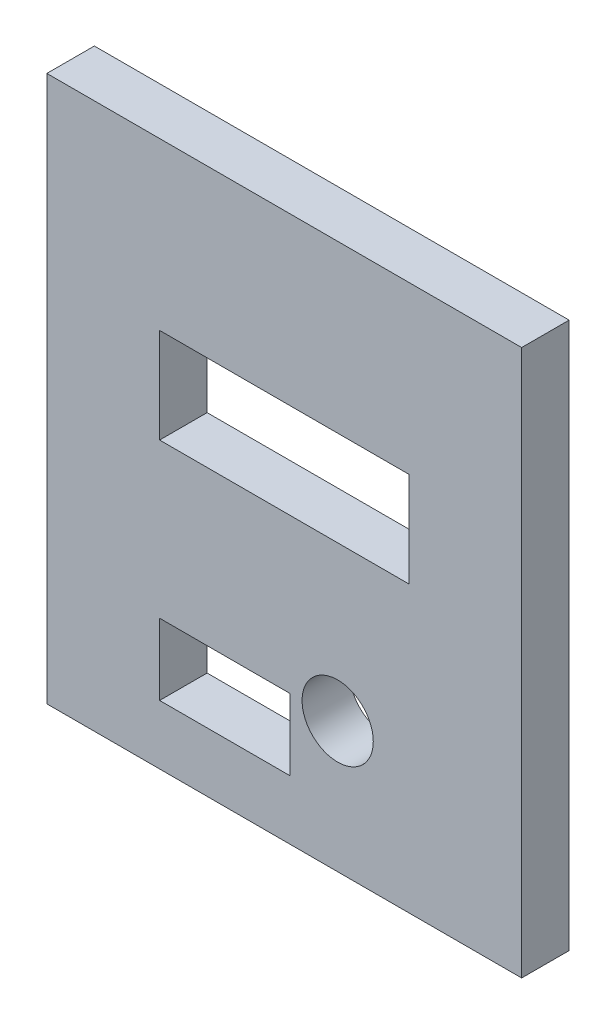
ISO-10303-21;
HEADER;
FILE_DESCRIPTION(('STEP AP214'),'2;1');
FILE_NAME('part.step','',(''),(''),'','','');
FILE_SCHEMA(('AUTOMOTIVE_DESIGN { 1 0 10303 214 1 1 1 1 }'));
ENDSEC;
DATA;
#1=APPLICATION_CONTEXT('core data for automotive mechanical design processes');
#2=APPLICATION_PROTOCOL_DEFINITION('international standard','automotive_design',2000,#1);
#3=PRODUCT_CONTEXT('',#1,'mechanical');
#4=PRODUCT('Part','Part','',(#3));
#5=PRODUCT_RELATED_PRODUCT_CATEGORY('part','',(#4));
#6=PRODUCT_DEFINITION_FORMATION('','',#4);
#7=PRODUCT_DEFINITION_CONTEXT('part definition',#1,'design');
#8=PRODUCT_DEFINITION('design','',#6,#7);
#9=PRODUCT_DEFINITION_SHAPE('','',#8);
#10=(LENGTH_UNIT() NAMED_UNIT(*) SI_UNIT(.MILLI.,.METRE.));
#11=(NAMED_UNIT(*) PLANE_ANGLE_UNIT() SI_UNIT($,.RADIAN.));
#12=(NAMED_UNIT(*) SI_UNIT($,.STERADIAN.) SOLID_ANGLE_UNIT());
#13=UNCERTAINTY_MEASURE_WITH_UNIT(LENGTH_MEASURE(1.E-05),#10,'distance_accuracy_value','');
#14=(GEOMETRIC_REPRESENTATION_CONTEXT(3) GLOBAL_UNCERTAINTY_ASSIGNED_CONTEXT((#13)) GLOBAL_UNIT_ASSIGNED_CONTEXT((#10,
#11,#12)) REPRESENTATION_CONTEXT('',''));
#15=CARTESIAN_POINT('',(0.,0.,0.));
#16=DIRECTION('',(0.,0.,1.));
#17=DIRECTION('',(1.,0.,0.));
#18=AXIS2_PLACEMENT_3D('',#15,#16,#17);
#19=CARTESIAN_POINT('',(0.,0.,2.));
#20=DIRECTION('',(0.,0.,1.));
#21=DIRECTION('',(1.,0.,0.));
#22=AXIS2_PLACEMENT_3D('',#19,#20,#21);
#23=PLANE('',#22);
#24=CARTESIAN_POINT('',(2.25,-6.,2.));
#25=DIRECTION('',(0.,0.,1.));
#26=DIRECTION('',(1.,0.,0.));
#27=AXIS2_PLACEMENT_3D('',#24,#25,#26);
#28=CIRCLE('',#27,1.5);
#29=CARTESIAN_POINT('',(3.75,-6.,2.));
#30=VERTEX_POINT('',#29);
#31=EDGE_CURVE('E224',#30,#30,#28,.T.);
#32=ORIENTED_EDGE('',*,*,#31,.F.);
#33=EDGE_LOOP('',(#32));
#34=FACE_BOUND('',#33,.T.);
#35=DIRECTION('',(0.,1.,0.));
#36=VECTOR('',#35,1.);
#37=CARTESIAN_POINT('',(0.25,0.,2.));
#38=LINE('',#37,#36);
#39=CARTESIAN_POINT('',(0.25,-9.,2.));
#40=VERTEX_POINT('',#39);
#41=CARTESIAN_POINT('',(0.25,-6.,2.));
#42=VERTEX_POINT('',#41);
#43=EDGE_CURVE('E50',#40,#42,#38,.T.);
#44=ORIENTED_EDGE('',*,*,#43,.F.);
#45=DIRECTION('',(-1.,0.,0.));
#46=VECTOR('',#45,1.);
#47=CARTESIAN_POINT('',(0.,-9.,2.));
#48=LINE('',#47,#46);
#49=CARTESIAN_POINT('',(-5.25,-9.,2.));
#50=VERTEX_POINT('',#49);
#51=EDGE_CURVE('E142',#40,#50,#48,.T.);
#52=ORIENTED_EDGE('',*,*,#51,.T.);
#53=DIRECTION('',(0.,1.,0.));
#54=VECTOR('',#53,1.);
#55=CARTESIAN_POINT('',(-5.25,0.,2.));
#56=LINE('',#55,#54);
#57=CARTESIAN_POINT('',(-5.25,-6.,2.));
#58=VERTEX_POINT('',#57);
#59=EDGE_CURVE('E127',#50,#58,#56,.T.);
#60=ORIENTED_EDGE('',*,*,#59,.T.);
#61=DIRECTION('',(-1.,0.,0.));
#62=VECTOR('',#61,1.);
#63=CARTESIAN_POINT('',(0.,-6.,2.));
#64=LINE('',#63,#62);
#65=EDGE_CURVE('E136',#42,#58,#64,.T.);
#66=ORIENTED_EDGE('',*,*,#65,.F.);
#67=EDGE_LOOP('',(#44,#52,#60,#66));
#68=FACE_BOUND('',#67,.T.);
#69=DIRECTION('',(0.,-1.,0.));
#70=VECTOR('',#69,1.);
#71=CARTESIAN_POINT('',(-10.,-11.5,2.));
#72=LINE('',#71,#70);
#73=CARTESIAN_POINT('',(-10.,11.5,2.));
#74=VERTEX_POINT('',#73);
#75=CARTESIAN_POINT('',(-10.,-11.5,2.));
#76=VERTEX_POINT('',#75);
#77=EDGE_CURVE('E173',#74,#76,#72,.T.);
#78=ORIENTED_EDGE('',*,*,#77,.T.);
#79=DIRECTION('',(1.,0.,0.));
#80=VECTOR('',#79,1.);
#81=CARTESIAN_POINT('',(10.,-11.5,2.));
#82=LINE('',#81,#80);
#83=CARTESIAN_POINT('',(10.,-11.5,2.));
#84=VERTEX_POINT('',#83);
#85=EDGE_CURVE('E176',#76,#84,#82,.T.);
#86=ORIENTED_EDGE('',*,*,#85,.T.);
#87=DIRECTION('',(0.,1.,0.));
#88=VECTOR('',#87,1.);
#89=CARTESIAN_POINT('',(10.,-11.5,2.));
#90=LINE('',#89,#88);
#91=CARTESIAN_POINT('',(10.,11.5,2.));
#92=VERTEX_POINT('',#91);
#93=EDGE_CURVE('E179',#84,#92,#90,.T.);
#94=ORIENTED_EDGE('',*,*,#93,.T.);
#95=DIRECTION('',(-1.,0.,0.));
#96=VECTOR('',#95,1.);
#97=CARTESIAN_POINT('',(10.,11.5,2.));
#98=LINE('',#97,#96);
#99=EDGE_CURVE('E181',#92,#74,#98,.T.);
#100=ORIENTED_EDGE('',*,*,#99,.T.);
#101=EDGE_LOOP('',(#78,#86,#94,#100));
#102=FACE_BOUND('',#101,.T.);
#103=DIRECTION('',(0.,1.,0.));
#104=VECTOR('',#103,1.);
#105=CARTESIAN_POINT('',(5.25,0.,2.));
#106=LINE('',#105,#104);
#107=CARTESIAN_POINT('',(5.25,0.499999999999999,2.));
#108=VERTEX_POINT('',#107);
#109=CARTESIAN_POINT('',(5.25,4.5,2.));
#110=VERTEX_POINT('',#109);
#111=EDGE_CURVE('E154',#108,#110,#106,.T.);
#112=ORIENTED_EDGE('',*,*,#111,.F.);
#113=DIRECTION('',(-1.,0.,0.));
#114=VECTOR('',#113,1.);
#115=CARTESIAN_POINT('',(0.,0.499999999999999,2.));
#116=LINE('',#115,#114);
#117=CARTESIAN_POINT('',(-5.25,0.499999999999999,2.));
#118=VERTEX_POINT('',#117);
#119=EDGE_CURVE('E149',#108,#118,#116,.T.);
#120=ORIENTED_EDGE('',*,*,#119,.T.);
#121=DIRECTION('',(0.,1.,0.));
#122=VECTOR('',#121,1.);
#123=CARTESIAN_POINT('',(-5.25,0.,2.));
#124=LINE('',#123,#122);
#125=CARTESIAN_POINT('',(-5.25,4.5,2.));
#126=VERTEX_POINT('',#125);
#127=EDGE_CURVE('E160',#118,#126,#124,.T.);
#128=ORIENTED_EDGE('',*,*,#127,.T.);
#129=DIRECTION('',(-1.,0.,0.));
#130=VECTOR('',#129,1.);
#131=CARTESIAN_POINT('',(0.,4.5,2.));
#132=LINE('',#131,#130);
#133=EDGE_CURVE('E157',#110,#126,#132,.T.);
#134=ORIENTED_EDGE('',*,*,#133,.F.);
#135=EDGE_LOOP('',(#112,#120,#128,#134));
#136=FACE_BOUND('',#135,.T.);
#137=ADVANCED_FACE('F34',(#34,#68,#102,#136),#23,.T.);
#138=CARTESIAN_POINT('',(0.,0.,0.));
#139=DIRECTION('',(0.,0.,1.));
#140=DIRECTION('',(1.,0.,0.));
#141=AXIS2_PLACEMENT_3D('',#138,#139,#140);
#142=PLANE('',#141);
#143=CARTESIAN_POINT('',(2.25,-6.,0.));
#144=DIRECTION('',(0.,0.,1.));
#145=DIRECTION('',(1.,0.,0.));
#146=AXIS2_PLACEMENT_3D('',#143,#144,#145);
#147=CIRCLE('',#146,1.5);
#148=CARTESIAN_POINT('',(3.75,-6.,0.));
#149=VERTEX_POINT('',#148);
#150=EDGE_CURVE('E38',#149,#149,#147,.T.);
#151=ORIENTED_EDGE('',*,*,#150,.T.);
#152=EDGE_LOOP('',(#151));
#153=FACE_BOUND('',#152,.T.);
#154=DIRECTION('',(-1.,0.,0.));
#155=VECTOR('',#154,1.);
#156=CARTESIAN_POINT('',(0.,-9.,0.));
#157=LINE('',#156,#155);
#158=CARTESIAN_POINT('',(0.25,-9.,0.));
#159=VERTEX_POINT('',#158);
#160=CARTESIAN_POINT('',(-5.25,-9.,0.));
#161=VERTEX_POINT('',#160);
#162=EDGE_CURVE('E43',#159,#161,#157,.T.);
#163=ORIENTED_EDGE('',*,*,#162,.F.);
#164=DIRECTION('',(0.,1.,0.));
#165=VECTOR('',#164,1.);
#166=CARTESIAN_POINT('',(0.25,0.,0.));
#167=LINE('',#166,#165);
#168=CARTESIAN_POINT('',(0.25,-6.,0.));
#169=VERTEX_POINT('',#168);
#170=EDGE_CURVE('E11',#159,#169,#167,.T.);
#171=ORIENTED_EDGE('',*,*,#170,.T.);
#172=DIRECTION('',(-1.,0.,0.));
#173=VECTOR('',#172,1.);
#174=CARTESIAN_POINT('',(0.,-6.,0.));
#175=LINE('',#174,#173);
#176=CARTESIAN_POINT('',(-5.25,-6.,0.));
#177=VERTEX_POINT('',#176);
#178=EDGE_CURVE('E212',#169,#177,#175,.T.);
#179=ORIENTED_EDGE('',*,*,#178,.T.);
#180=DIRECTION('',(0.,1.,0.));
#181=VECTOR('',#180,1.);
#182=CARTESIAN_POINT('',(-5.25,0.,0.));
#183=LINE('',#182,#181);
#184=EDGE_CURVE('E130',#161,#177,#183,.T.);
#185=ORIENTED_EDGE('',*,*,#184,.F.);
#186=EDGE_LOOP('',(#163,#171,#179,#185));
#187=FACE_BOUND('',#186,.T.);
#188=DIRECTION('',(0.,-1.,0.));
#189=VECTOR('',#188,1.);
#190=CARTESIAN_POINT('',(-10.,-11.5,0.));
#191=LINE('',#190,#189);
#192=CARTESIAN_POINT('',(-10.,11.5,0.));
#193=VERTEX_POINT('',#192);
#194=CARTESIAN_POINT('',(-10.,-11.5,0.));
#195=VERTEX_POINT('',#194);
#196=EDGE_CURVE('E166',#193,#195,#191,.T.);
#197=ORIENTED_EDGE('',*,*,#196,.F.);
#198=DIRECTION('',(-1.,0.,0.));
#199=VECTOR('',#198,1.);
#200=CARTESIAN_POINT('',(10.,11.5,0.));
#201=LINE('',#200,#199);
#202=CARTESIAN_POINT('',(10.,11.5,0.));
#203=VERTEX_POINT('',#202);
#204=EDGE_CURVE('E177',#203,#193,#201,.T.);
#205=ORIENTED_EDGE('',*,*,#204,.F.);
#206=DIRECTION('',(0.,1.,0.));
#207=VECTOR('',#206,1.);
#208=CARTESIAN_POINT('',(10.,-11.5,0.));
#209=LINE('',#208,#207);
#210=CARTESIAN_POINT('',(10.,-11.5,0.));
#211=VERTEX_POINT('',#210);
#212=EDGE_CURVE('E188',#211,#203,#209,.T.);
#213=ORIENTED_EDGE('',*,*,#212,.F.);
#214=DIRECTION('',(1.,0.,0.));
#215=VECTOR('',#214,1.);
#216=CARTESIAN_POINT('',(10.,-11.5,0.));
#217=LINE('',#216,#215);
#218=EDGE_CURVE('E186',#195,#211,#217,.T.);
#219=ORIENTED_EDGE('',*,*,#218,.F.);
#220=EDGE_LOOP('',(#197,#205,#213,#219));
#221=FACE_BOUND('',#220,.T.);
#222=DIRECTION('',(-1.,0.,0.));
#223=VECTOR('',#222,1.);
#224=CARTESIAN_POINT('',(0.,0.499999999999999,0.));
#225=LINE('',#224,#223);
#226=CARTESIAN_POINT('',(5.25,0.499999999999999,0.));
#227=VERTEX_POINT('',#226);
#228=CARTESIAN_POINT('',(-5.25,0.499999999999999,0.));
#229=VERTEX_POINT('',#228);
#230=EDGE_CURVE('E210',#227,#229,#225,.T.);
#231=ORIENTED_EDGE('',*,*,#230,.F.);
#232=DIRECTION('',(0.,1.,0.));
#233=VECTOR('',#232,1.);
#234=CARTESIAN_POINT('',(5.25,0.,0.));
#235=LINE('',#234,#233);
#236=CARTESIAN_POINT('',(5.25,4.5,0.));
#237=VERTEX_POINT('',#236);
#238=EDGE_CURVE('E202',#227,#237,#235,.T.);
#239=ORIENTED_EDGE('',*,*,#238,.T.);
#240=DIRECTION('',(-1.,0.,0.));
#241=VECTOR('',#240,1.);
#242=CARTESIAN_POINT('',(0.,4.5,0.));
#243=LINE('',#242,#241);
#244=CARTESIAN_POINT('',(-5.25,4.5,0.));
#245=VERTEX_POINT('',#244);
#246=EDGE_CURVE('E205',#237,#245,#243,.T.);
#247=ORIENTED_EDGE('',*,*,#246,.T.);
#248=DIRECTION('',(0.,1.,0.));
#249=VECTOR('',#248,1.);
#250=CARTESIAN_POINT('',(-5.25,0.,0.));
#251=LINE('',#250,#249);
#252=EDGE_CURVE('E208',#229,#245,#251,.T.);
#253=ORIENTED_EDGE('',*,*,#252,.F.);
#254=EDGE_LOOP('',(#231,#239,#247,#253));
#255=FACE_BOUND('',#254,.T.);
#256=ADVANCED_FACE('F220',(#153,#187,#221,#255),#142,.F.);
#257=CARTESIAN_POINT('',(-10.,-11.5,2.));
#258=DIRECTION('',(1.,0.,0.));
#259=DIRECTION('',(0.,1.,0.));
#260=AXIS2_PLACEMENT_3D('',#257,#258,#259);
#261=PLANE('',#260);
#262=ORIENTED_EDGE('',*,*,#196,.T.);
#263=DIRECTION('',(0.,0.,-1.));
#264=VECTOR('',#263,1.);
#265=CARTESIAN_POINT('',(-10.,-11.5,2.));
#266=LINE('',#265,#264);
#267=EDGE_CURVE('E199',#76,#195,#266,.T.);
#268=ORIENTED_EDGE('',*,*,#267,.F.);
#269=ORIENTED_EDGE('',*,*,#77,.F.);
#270=DIRECTION('',(0.,0.,-1.));
#271=VECTOR('',#270,1.);
#272=CARTESIAN_POINT('',(-10.,11.5,2.));
#273=LINE('',#272,#271);
#274=EDGE_CURVE('E183',#74,#193,#273,.T.);
#275=ORIENTED_EDGE('',*,*,#274,.T.);
#276=EDGE_LOOP('',(#262,#268,#269,#275));
#277=FACE_BOUND('',#276,.T.);
#278=ADVANCED_FACE('F36',(#277),#261,.F.);
#279=CARTESIAN_POINT('',(10.,-11.5,2.));
#280=DIRECTION('',(0.,1.,0.));
#281=DIRECTION('',(-1.,0.,0.));
#282=AXIS2_PLACEMENT_3D('',#279,#280,#281);
#283=PLANE('',#282);
#284=ORIENTED_EDGE('',*,*,#218,.T.);
#285=DIRECTION('',(0.,0.,-1.));
#286=VECTOR('',#285,1.);
#287=CARTESIAN_POINT('',(10.,-11.5,2.));
#288=LINE('',#287,#286);
#289=EDGE_CURVE('E196',#84,#211,#288,.T.);
#290=ORIENTED_EDGE('',*,*,#289,.F.);
#291=ORIENTED_EDGE('',*,*,#85,.F.);
#292=ORIENTED_EDGE('',*,*,#267,.T.);
#293=EDGE_LOOP('',(#284,#290,#291,#292));
#294=FACE_BOUND('',#293,.T.);
#295=ADVANCED_FACE('F249',(#294),#283,.F.);
#296=CARTESIAN_POINT('',(10.,-11.5,2.));
#297=DIRECTION('',(-1.,0.,0.));
#298=DIRECTION('',(0.,0.,1.));
#299=AXIS2_PLACEMENT_3D('',#296,#297,#298);
#300=PLANE('',#299);
#301=ORIENTED_EDGE('',*,*,#212,.T.);
#302=DIRECTION('',(0.,0.,-1.));
#303=VECTOR('',#302,1.);
#304=CARTESIAN_POINT('',(10.,11.5,2.));
#305=LINE('',#304,#303);
#306=EDGE_CURVE('E193',#92,#203,#305,.T.);
#307=ORIENTED_EDGE('',*,*,#306,.F.);
#308=ORIENTED_EDGE('',*,*,#93,.F.);
#309=ORIENTED_EDGE('',*,*,#289,.T.);
#310=EDGE_LOOP('',(#301,#307,#308,#309));
#311=FACE_BOUND('',#310,.T.);
#312=ADVANCED_FACE('F246',(#311),#300,.F.);
#313=CARTESIAN_POINT('',(10.,11.5,2.));
#314=DIRECTION('',(0.,-1.,0.));
#315=DIRECTION('',(1.,0.,0.));
#316=AXIS2_PLACEMENT_3D('',#313,#314,#315);
#317=PLANE('',#316);
#318=ORIENTED_EDGE('',*,*,#204,.T.);
#319=ORIENTED_EDGE('',*,*,#274,.F.);
#320=ORIENTED_EDGE('',*,*,#99,.F.);
#321=ORIENTED_EDGE('',*,*,#306,.T.);
#322=EDGE_LOOP('',(#318,#319,#320,#321));
#323=FACE_BOUND('',#322,.T.);
#324=ADVANCED_FACE('F243',(#323),#317,.F.);
#325=CARTESIAN_POINT('',(0.,0.499999999999999,-8.));
#326=DIRECTION('',(0.,1.,0.));
#327=DIRECTION('',(0.,0.,1.));
#328=AXIS2_PLACEMENT_3D('',#325,#326,#327);
#329=PLANE('',#328);
#330=ORIENTED_EDGE('',*,*,#230,.T.);
#331=DIRECTION('',(0.,0.,1.));
#332=VECTOR('',#331,1.);
#333=CARTESIAN_POINT('',(-5.25,0.499999999999999,-8.));
#334=LINE('',#333,#332);
#335=EDGE_CURVE('E164',#229,#118,#334,.T.);
#336=ORIENTED_EDGE('',*,*,#335,.T.);
#337=ORIENTED_EDGE('',*,*,#119,.F.);
#338=DIRECTION('',(0.,0.,1.));
#339=VECTOR('',#338,1.);
#340=CARTESIAN_POINT('',(5.25,0.499999999999999,-8.));
#341=LINE('',#340,#339);
#342=EDGE_CURVE('E163',#227,#108,#341,.T.);
#343=ORIENTED_EDGE('',*,*,#342,.F.);
#344=EDGE_LOOP('',(#330,#336,#337,#343));
#345=FACE_BOUND('',#344,.T.);
#346=ADVANCED_FACE('F240',(#345),#329,.T.);
#347=CARTESIAN_POINT('',(-5.25,0.,-8.));
#348=DIRECTION('',(1.,0.,0.));
#349=DIRECTION('',(0.,0.,-1.));
#350=AXIS2_PLACEMENT_3D('',#347,#348,#349);
#351=PLANE('',#350);
#352=ORIENTED_EDGE('',*,*,#252,.T.);
#353=DIRECTION('',(0.,0.,1.));
#354=VECTOR('',#353,1.);
#355=CARTESIAN_POINT('',(-5.25,4.5,-8.));
#356=LINE('',#355,#354);
#357=EDGE_CURVE('E167',#245,#126,#356,.T.);
#358=ORIENTED_EDGE('',*,*,#357,.T.);
#359=ORIENTED_EDGE('',*,*,#127,.F.);
#360=ORIENTED_EDGE('',*,*,#335,.F.);
#361=EDGE_LOOP('',(#352,#358,#359,#360));
#362=FACE_BOUND('',#361,.T.);
#363=ADVANCED_FACE('F281',(#362),#351,.T.);
#364=CARTESIAN_POINT('',(0.,4.5,-8.));
#365=DIRECTION('',(0.,1.,0.));
#366=DIRECTION('',(0.,0.,1.));
#367=AXIS2_PLACEMENT_3D('',#364,#365,#366);
#368=PLANE('',#367);
#369=DIRECTION('',(0.,0.,1.));
#370=VECTOR('',#369,1.);
#371=CARTESIAN_POINT('',(5.25,4.5,-8.));
#372=LINE('',#371,#370);
#373=EDGE_CURVE('E169',#237,#110,#372,.T.);
#374=ORIENTED_EDGE('',*,*,#373,.T.);
#375=ORIENTED_EDGE('',*,*,#133,.T.);
#376=ORIENTED_EDGE('',*,*,#357,.F.);
#377=ORIENTED_EDGE('',*,*,#246,.F.);
#378=EDGE_LOOP('',(#374,#375,#376,#377));
#379=FACE_BOUND('',#378,.T.);
#380=ADVANCED_FACE('F284',(#379),#368,.F.);
#381=CARTESIAN_POINT('',(5.25,0.,-8.));
#382=DIRECTION('',(1.,0.,0.));
#383=DIRECTION('',(0.,0.,-1.));
#384=AXIS2_PLACEMENT_3D('',#381,#382,#383);
#385=PLANE('',#384);
#386=ORIENTED_EDGE('',*,*,#342,.T.);
#387=ORIENTED_EDGE('',*,*,#111,.T.);
#388=ORIENTED_EDGE('',*,*,#373,.F.);
#389=ORIENTED_EDGE('',*,*,#238,.F.);
#390=EDGE_LOOP('',(#386,#387,#388,#389));
#391=FACE_BOUND('',#390,.T.);
#392=ADVANCED_FACE('F272',(#391),#385,.F.);
#393=CARTESIAN_POINT('',(0.25,0.,-8.));
#394=DIRECTION('',(1.,0.,0.));
#395=DIRECTION('',(0.,0.,-1.));
#396=AXIS2_PLACEMENT_3D('',#393,#394,#395);
#397=PLANE('',#396);
#398=DIRECTION('',(0.,0.,1.));
#399=VECTOR('',#398,1.);
#400=CARTESIAN_POINT('',(0.25,-9.,-8.));
#401=LINE('',#400,#399);
#402=EDGE_CURVE('E147',#159,#40,#401,.T.);
#403=ORIENTED_EDGE('',*,*,#402,.T.);
#404=ORIENTED_EDGE('',*,*,#43,.T.);
#405=DIRECTION('',(0.,0.,1.));
#406=VECTOR('',#405,1.);
#407=CARTESIAN_POINT('',(0.25,-6.,-8.));
#408=LINE('',#407,#406);
#409=EDGE_CURVE('E133',#169,#42,#408,.T.);
#410=ORIENTED_EDGE('',*,*,#409,.F.);
#411=ORIENTED_EDGE('',*,*,#170,.F.);
#412=EDGE_LOOP('',(#403,#404,#410,#411));
#413=FACE_BOUND('',#412,.T.);
#414=ADVANCED_FACE('F222',(#413),#397,.F.);
#415=CARTESIAN_POINT('',(0.,-9.,-8.));
#416=DIRECTION('',(0.,1.,0.));
#417=DIRECTION('',(0.,0.,1.));
#418=AXIS2_PLACEMENT_3D('',#415,#416,#417);
#419=PLANE('',#418);
#420=ORIENTED_EDGE('',*,*,#162,.T.);
#421=DIRECTION('',(0.,0.,1.));
#422=VECTOR('',#421,1.);
#423=CARTESIAN_POINT('',(-5.25,-9.,-8.));
#424=LINE('',#423,#422);
#425=EDGE_CURVE('E132',#161,#50,#424,.T.);
#426=ORIENTED_EDGE('',*,*,#425,.T.);
#427=ORIENTED_EDGE('',*,*,#51,.F.);
#428=ORIENTED_EDGE('',*,*,#402,.F.);
#429=EDGE_LOOP('',(#420,#426,#427,#428));
#430=FACE_BOUND('',#429,.T.);
#431=ADVANCED_FACE('F218',(#430),#419,.T.);
#432=CARTESIAN_POINT('',(-5.25,0.,-8.));
#433=DIRECTION('',(1.,0.,0.));
#434=DIRECTION('',(0.,0.,-1.));
#435=AXIS2_PLACEMENT_3D('',#432,#433,#434);
#436=PLANE('',#435);
#437=ORIENTED_EDGE('',*,*,#184,.T.);
#438=DIRECTION('',(0.,0.,1.));
#439=VECTOR('',#438,1.);
#440=CARTESIAN_POINT('',(-5.25,-6.,-8.));
#441=LINE('',#440,#439);
#442=EDGE_CURVE('E58',#177,#58,#441,.T.);
#443=ORIENTED_EDGE('',*,*,#442,.T.);
#444=ORIENTED_EDGE('',*,*,#59,.F.);
#445=ORIENTED_EDGE('',*,*,#425,.F.);
#446=EDGE_LOOP('',(#437,#443,#444,#445));
#447=FACE_BOUND('',#446,.T.);
#448=ADVANCED_FACE('F124',(#447),#436,.T.);
#449=CARTESIAN_POINT('',(0.,-6.,-8.));
#450=DIRECTION('',(0.,1.,0.));
#451=DIRECTION('',(-1.,0.,0.));
#452=AXIS2_PLACEMENT_3D('',#449,#450,#451);
#453=PLANE('',#452);
#454=ORIENTED_EDGE('',*,*,#409,.T.);
#455=ORIENTED_EDGE('',*,*,#65,.T.);
#456=ORIENTED_EDGE('',*,*,#442,.F.);
#457=ORIENTED_EDGE('',*,*,#178,.F.);
#458=EDGE_LOOP('',(#454,#455,#456,#457));
#459=FACE_BOUND('',#458,.T.);
#460=ADVANCED_FACE('F137',(#459),#453,.F.);
#461=CARTESIAN_POINT('',(2.25,-6.,-8.));
#462=DIRECTION('',(0.,0.,1.));
#463=DIRECTION('',(1.,0.,0.));
#464=AXIS2_PLACEMENT_3D('',#461,#462,#463);
#465=CYLINDRICAL_SURFACE('',#464,1.5);
#466=ORIENTED_EDGE('',*,*,#31,.T.);
#467=EDGE_LOOP('',(#466));
#468=FACE_BOUND('',#467,.T.);
#469=ORIENTED_EDGE('',*,*,#150,.F.);
#470=EDGE_LOOP('',(#469));
#471=FACE_BOUND('',#470,.T.);
#472=ADVANCED_FACE('F229',(#468,#471),#465,.F.);
#473=CLOSED_SHELL('',(#137,#256,#278,#295,#312,#324,#346,#363,#380,#392,#414,#431,#448,#460,#472));
#474=MANIFOLD_SOLID_BREP('B2',#473);
#475=ADVANCED_BREP_SHAPE_REPRESENTATION('',(#18,#474),#14);
#476=SHAPE_DEFINITION_REPRESENTATION(#9,#475);
ENDSEC;
END-ISO-10303-21;
